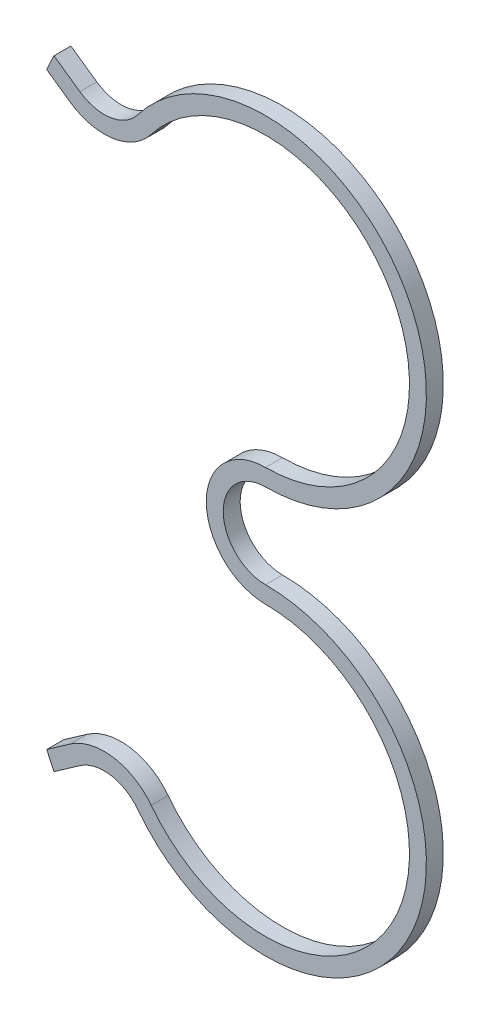
ISO-10303-21;
HEADER;
FILE_DESCRIPTION(('STEP AP214'),'2;1');
FILE_NAME('part.step','',(''),(''),'','','');
FILE_SCHEMA(('AUTOMOTIVE_DESIGN { 1 0 10303 214 1 1 1 1 }'));
ENDSEC;
DATA;
#1=APPLICATION_CONTEXT('core data for automotive mechanical design processes');
#2=APPLICATION_PROTOCOL_DEFINITION('international standard','automotive_design',2000,#1);
#3=PRODUCT_CONTEXT('',#1,'mechanical');
#4=PRODUCT('Part','Part','',(#3));
#5=PRODUCT_RELATED_PRODUCT_CATEGORY('part','',(#4));
#6=PRODUCT_DEFINITION_FORMATION('','',#4);
#7=PRODUCT_DEFINITION_CONTEXT('part definition',#1,'design');
#8=PRODUCT_DEFINITION('design','',#6,#7);
#9=PRODUCT_DEFINITION_SHAPE('','',#8);
#10=(LENGTH_UNIT() NAMED_UNIT(*) SI_UNIT(.MILLI.,.METRE.));
#11=(NAMED_UNIT(*) PLANE_ANGLE_UNIT() SI_UNIT($,.RADIAN.));
#12=(NAMED_UNIT(*) SI_UNIT($,.STERADIAN.) SOLID_ANGLE_UNIT());
#13=UNCERTAINTY_MEASURE_WITH_UNIT(LENGTH_MEASURE(1.E-05),#10,'distance_accuracy_value','');
#14=(GEOMETRIC_REPRESENTATION_CONTEXT(3) GLOBAL_UNCERTAINTY_ASSIGNED_CONTEXT((#13)) GLOBAL_UNIT_ASSIGNED_CONTEXT((#10,
#11,#12)) REPRESENTATION_CONTEXT('',''));
#15=CARTESIAN_POINT('',(0.,0.,0.));
#16=DIRECTION('',(0.,0.,1.));
#17=DIRECTION('',(1.,0.,0.));
#18=AXIS2_PLACEMENT_3D('',#15,#16,#17);
#19=CARTESIAN_POINT('',(0.,12.,1.));
#20=DIRECTION('',(0.,0.,-1.));
#21=DIRECTION('',(-1.,0.,0.));
#22=AXIS2_PLACEMENT_3D('',#19,#20,#21);
#23=CYLINDRICAL_SURFACE('',#22,14.);
#24=DIRECTION('',(0.,0.,-1.));
#25=VECTOR('',#24,1.);
#26=CARTESIAN_POINT('',(-12.4976565513617,18.3094041496965,1.));
#27=LINE('',#26,#25);
#28=CARTESIAN_POINT('',(-12.4976565513617,18.3094041496965,0.));
#29=VERTEX_POINT('',#28);
#30=CARTESIAN_POINT('',(-12.4976565513617,18.3094041496965,1.));
#31=VERTEX_POINT('',#30);
#32=EDGE_CURVE('E153',#29,#31,#27,.F.);
#33=ORIENTED_EDGE('',*,*,#32,.F.);
#34=CARTESIAN_POINT('',(0.,12.,0.));
#35=DIRECTION('',(0.,0.,1.));
#36=DIRECTION('',(1.,0.,0.));
#37=AXIS2_PLACEMENT_3D('',#34,#35,#36);
#38=CIRCLE('',#37,14.);
#39=CARTESIAN_POINT('',(-12.9224650406686,17.3860836674432,0.));
#40=VERTEX_POINT('',#39);
#41=EDGE_CURVE('E150',#29,#40,#38,.T.);
#42=ORIENTED_EDGE('',*,*,#41,.T.);
#43=DIRECTION('',(0.,0.,-1.));
#44=VECTOR('',#43,1.);
#45=CARTESIAN_POINT('',(-12.9224650406686,17.3860836674432,1.));
#46=LINE('',#45,#44);
#47=CARTESIAN_POINT('',(-12.9224650406686,17.3860836674432,1.));
#48=VERTEX_POINT('',#47);
#49=EDGE_CURVE('E47',#48,#40,#46,.T.);
#50=ORIENTED_EDGE('',*,*,#49,.F.);
#51=CARTESIAN_POINT('',(0.,12.,1.));
#52=DIRECTION('',(0.,0.,1.));
#53=DIRECTION('',(1.,0.,0.));
#54=AXIS2_PLACEMENT_3D('',#51,#52,#53);
#55=CIRCLE('',#54,14.);
#56=EDGE_CURVE('E103',#31,#48,#55,.T.);
#57=ORIENTED_EDGE('',*,*,#56,.F.);
#58=EDGE_LOOP('',(#33,#42,#50,#57));
#59=FACE_BOUND('',#58,.T.);
#60=ADVANCED_FACE('F40',(#59),#23,.T.);
#61=CARTESIAN_POINT('',(0.,-12.,1.));
#62=DIRECTION('',(0.,0.,-1.));
#63=DIRECTION('',(-1.,0.,0.));
#64=AXIS2_PLACEMENT_3D('',#61,#62,#63);
#65=CYLINDRICAL_SURFACE('',#64,14.);
#66=DIRECTION('',(0.,0.,-1.));
#67=VECTOR('',#66,1.);
#68=CARTESIAN_POINT('',(-12.4976565513617,-18.3094041496964,1.));
#69=LINE('',#68,#67);
#70=CARTESIAN_POINT('',(-12.4976565513617,-18.3094041496964,1.));
#71=VERTEX_POINT('',#70);
#72=CARTESIAN_POINT('',(-12.4976565513617,-18.3094041496964,0.));
#73=VERTEX_POINT('',#72);
#74=EDGE_CURVE('E53',#71,#73,#69,.T.);
#75=ORIENTED_EDGE('',*,*,#74,.F.);
#76=CARTESIAN_POINT('',(0.,-12.,1.));
#77=DIRECTION('',(0.,0.,1.));
#78=DIRECTION('',(1.,0.,0.));
#79=AXIS2_PLACEMENT_3D('',#76,#77,#78);
#80=CIRCLE('',#79,14.);
#81=CARTESIAN_POINT('',(-12.9224650406686,-17.3860836674432,1.));
#82=VERTEX_POINT('',#81);
#83=EDGE_CURVE('E144',#82,#71,#80,.T.);
#84=ORIENTED_EDGE('',*,*,#83,.F.);
#85=DIRECTION('',(0.,0.,-1.));
#86=VECTOR('',#85,1.);
#87=CARTESIAN_POINT('',(-12.9224650406686,-17.3860836674432,1.));
#88=LINE('',#87,#86);
#89=CARTESIAN_POINT('',(-12.9224650406686,-17.3860836674432,0.));
#90=VERTEX_POINT('',#89);
#91=EDGE_CURVE('E149',#82,#90,#88,.T.);
#92=ORIENTED_EDGE('',*,*,#91,.T.);
#93=CARTESIAN_POINT('',(0.,-12.,0.));
#94=DIRECTION('',(0.,0.,1.));
#95=DIRECTION('',(1.,0.,0.));
#96=AXIS2_PLACEMENT_3D('',#93,#94,#95);
#97=CIRCLE('',#96,14.);
#98=EDGE_CURVE('E165',#90,#73,#97,.T.);
#99=ORIENTED_EDGE('',*,*,#98,.T.);
#100=EDGE_LOOP('',(#75,#84,#92,#99));
#101=FACE_BOUND('',#100,.T.);
#102=ADVANCED_FACE('F332',(#101),#65,.T.);
#103=CARTESIAN_POINT('',(0.,12.,1.));
#104=DIRECTION('',(0.,0.,1.));
#105=DIRECTION('',(1.,0.,0.));
#106=AXIS2_PLACEMENT_3D('',#103,#104,#105);
#107=PLANE('',#106);
#108=CARTESIAN_POINT('',(-9.53449977279251,19.2865159083488,1.));
#109=DIRECTION('',(0.,0.,-1.));
#110=DIRECTION('',(1.,0.,0.));
#111=AXIS2_PLACEMENT_3D('',#108,#109,#110);
#112=CIRCLE('',#111,2.5);
#113=CARTESIAN_POINT('',(-7.54814565346074,17.7684917607761,1.));
#114=VERTEX_POINT('',#113);
#115=CARTESIAN_POINT('',(-10.9684408636701,17.2386357976263,1.));
#116=VERTEX_POINT('',#115);
#117=EDGE_CURVE('E236',#114,#116,#112,.T.);
#118=ORIENTED_EDGE('',*,*,#117,.T.);
#119=DIRECTION('',(-0.819152044288993,0.573576436351044,0.));
#120=VECTOR('',#119,1.);
#121=CARTESIAN_POINT('',(-12.3488886043175,18.2052357117322,1.));
#122=LINE('',#121,#120);
#123=EDGE_CURVE('E233',#116,#31,#122,.T.);
#124=ORIENTED_EDGE('',*,*,#123,.T.);
#125=ORIENTED_EDGE('',*,*,#56,.T.);
#126=DIRECTION('',(0.819152044288992,-0.573576436351046,0.));
#127=VECTOR('',#126,1.);
#128=CARTESIAN_POINT('',(-12.9224650406686,17.3860836674432,1.));
#129=LINE('',#128,#127);
#130=CARTESIAN_POINT('',(-11.5420173000212,16.4194837533373,1.));
#131=VERTEX_POINT('',#130);
#132=EDGE_CURVE('E185',#48,#131,#129,.T.);
#133=ORIENTED_EDGE('',*,*,#132,.T.);
#134=CARTESIAN_POINT('',(-9.53449977279251,19.2865159083488,1.));
#135=DIRECTION('',(0.,0.,1.));
#136=DIRECTION('',(1.,0.,0.));
#137=AXIS2_PLACEMENT_3D('',#134,#135,#136);
#138=CIRCLE('',#137,3.5);
#139=CARTESIAN_POINT('',(-6.75360400572803,17.161282101747,1.));
#140=VERTEX_POINT('',#139);
#141=EDGE_CURVE('E206',#131,#140,#138,.T.);
#142=ORIENTED_EDGE('',*,*,#141,.T.);
#143=CARTESIAN_POINT('',(0.,12.,1.));
#144=DIRECTION('',(0.,0.,-1.));
#145=DIRECTION('',(1.,0.,0.));
#146=AXIS2_PLACEMENT_3D('',#143,#144,#145);
#147=CIRCLE('',#146,8.5);
#148=CARTESIAN_POINT('',(0.,3.5,1.));
#149=VERTEX_POINT('',#148);
#150=EDGE_CURVE('E205',#140,#149,#147,.T.);
#151=ORIENTED_EDGE('',*,*,#150,.T.);
#152=CARTESIAN_POINT('',(0.,0.,1.));
#153=DIRECTION('',(0.,0.,1.));
#154=DIRECTION('',(1.,0.,0.));
#155=AXIS2_PLACEMENT_3D('',#152,#153,#154);
#156=CIRCLE('',#155,3.5);
#157=CARTESIAN_POINT('',(0.,-3.5,1.));
#158=VERTEX_POINT('',#157);
#159=EDGE_CURVE('E127',#149,#158,#156,.T.);
#160=ORIENTED_EDGE('',*,*,#159,.T.);
#161=CARTESIAN_POINT('',(0.,-12.,1.));
#162=DIRECTION('',(0.,0.,-1.));
#163=DIRECTION('',(1.,0.,0.));
#164=AXIS2_PLACEMENT_3D('',#161,#162,#163);
#165=CIRCLE('',#164,8.5);
#166=CARTESIAN_POINT('',(-6.75360400572803,-17.161282101747,1.));
#167=VERTEX_POINT('',#166);
#168=EDGE_CURVE('E119',#158,#167,#165,.T.);
#169=ORIENTED_EDGE('',*,*,#168,.T.);
#170=CARTESIAN_POINT('',(-9.53449977279251,-19.2865159083488,1.));
#171=DIRECTION('',(0.,0.,1.));
#172=DIRECTION('',(1.,0.,0.));
#173=AXIS2_PLACEMENT_3D('',#170,#171,#172);
#174=CIRCLE('',#173,3.5);
#175=CARTESIAN_POINT('',(-11.5420173000212,-16.4194837533373,1.));
#176=VERTEX_POINT('',#175);
#177=EDGE_CURVE('E124',#167,#176,#174,.T.);
#178=ORIENTED_EDGE('',*,*,#177,.T.);
#179=DIRECTION('',(-0.819152044288992,-0.573576436351046,0.));
#180=VECTOR('',#179,1.);
#181=CARTESIAN_POINT('',(-11.5420173000212,-16.4194837533373,1.));
#182=LINE('',#181,#180);
#183=EDGE_CURVE('E62',#176,#82,#182,.T.);
#184=ORIENTED_EDGE('',*,*,#183,.T.);
#185=ORIENTED_EDGE('',*,*,#83,.T.);
#186=DIRECTION('',(0.819152044288993,0.573576436351044,0.));
#187=VECTOR('',#186,1.);
#188=CARTESIAN_POINT('',(-10.9684408636701,-17.2386357976263,1.));
#189=LINE('',#188,#187);
#190=CARTESIAN_POINT('',(-10.9684408636701,-17.2386357976263,1.));
#191=VERTEX_POINT('',#190);
#192=EDGE_CURVE('E250',#71,#191,#189,.T.);
#193=ORIENTED_EDGE('',*,*,#192,.T.);
#194=CARTESIAN_POINT('',(-9.53449977279251,-19.2865159083488,1.));
#195=DIRECTION('',(0.,0.,-1.));
#196=DIRECTION('',(1.,0.,0.));
#197=AXIS2_PLACEMENT_3D('',#194,#195,#196);
#198=CIRCLE('',#197,2.5);
#199=CARTESIAN_POINT('',(-7.54814565346074,-17.7684917607761,1.));
#200=VERTEX_POINT('',#199);
#201=EDGE_CURVE('E247',#191,#200,#198,.T.);
#202=ORIENTED_EDGE('',*,*,#201,.T.);
#203=CARTESIAN_POINT('',(0.,-12.,1.));
#204=DIRECTION('',(0.,0.,1.));
#205=DIRECTION('',(1.,0.,0.));
#206=AXIS2_PLACEMENT_3D('',#203,#204,#205);
#207=CIRCLE('',#206,9.5);
#208=CARTESIAN_POINT('',(0.,-2.5,1.));
#209=VERTEX_POINT('',#208);
#210=EDGE_CURVE('E244',#200,#209,#207,.T.);
#211=ORIENTED_EDGE('',*,*,#210,.T.);
#212=CARTESIAN_POINT('',(0.,0.,1.));
#213=DIRECTION('',(0.,0.,-1.));
#214=DIRECTION('',(1.,0.,0.));
#215=AXIS2_PLACEMENT_3D('',#212,#213,#214);
#216=CIRCLE('',#215,2.5);
#217=CARTESIAN_POINT('',(0.,2.5,1.));
#218=VERTEX_POINT('',#217);
#219=EDGE_CURVE('E241',#209,#218,#216,.T.);
#220=ORIENTED_EDGE('',*,*,#219,.T.);
#221=CARTESIAN_POINT('',(0.,12.,1.));
#222=DIRECTION('',(0.,0.,1.));
#223=DIRECTION('',(1.,0.,0.));
#224=AXIS2_PLACEMENT_3D('',#221,#222,#223);
#225=CIRCLE('',#224,9.5);
#226=EDGE_CURVE('E238',#218,#114,#225,.T.);
#227=ORIENTED_EDGE('',*,*,#226,.T.);
#228=EDGE_LOOP('',(#118,#124,#125,#133,#142,#151,#160,#169,#178,#184,#185,#193,#202,#211,#220,#227));
#229=FACE_BOUND('',#228,.T.);
#230=ADVANCED_FACE('F122',(#229),#107,.T.);
#231=CARTESIAN_POINT('',(0.,12.,0.));
#232=DIRECTION('',(0.,0.,1.));
#233=DIRECTION('',(1.,0.,0.));
#234=AXIS2_PLACEMENT_3D('',#231,#232,#233);
#235=PLANE('',#234);
#236=DIRECTION('',(-0.819152044288991,0.573576436351047,0.));
#237=VECTOR('',#236,1.);
#238=CARTESIAN_POINT('',(-12.3488886043175,18.2052357117322,0.));
#239=LINE('',#238,#237);
#240=CARTESIAN_POINT('',(-10.9684408636701,17.2386357976263,0.));
#241=VERTEX_POINT('',#240);
#242=EDGE_CURVE('E219',#241,#29,#239,.T.);
#243=ORIENTED_EDGE('',*,*,#242,.F.);
#244=CARTESIAN_POINT('',(-9.53449977279251,19.2865159083488,0.));
#245=DIRECTION('',(0.,0.,-1.));
#246=DIRECTION('',(1.,0.,0.));
#247=AXIS2_PLACEMENT_3D('',#244,#245,#246);
#248=CIRCLE('',#247,2.5);
#249=CARTESIAN_POINT('',(-7.54814565346074,17.7684917607761,0.));
#250=VERTEX_POINT('',#249);
#251=EDGE_CURVE('E255',#250,#241,#248,.T.);
#252=ORIENTED_EDGE('',*,*,#251,.F.);
#253=CARTESIAN_POINT('',(0.,12.,0.));
#254=DIRECTION('',(0.,0.,1.));
#255=DIRECTION('',(1.,0.,0.));
#256=AXIS2_PLACEMENT_3D('',#253,#254,#255);
#257=CIRCLE('',#256,9.5);
#258=CARTESIAN_POINT('',(0.,2.5,0.));
#259=VERTEX_POINT('',#258);
#260=EDGE_CURVE('E258',#259,#250,#257,.T.);
#261=ORIENTED_EDGE('',*,*,#260,.F.);
#262=CARTESIAN_POINT('',(0.,0.,0.));
#263=DIRECTION('',(0.,0.,-1.));
#264=DIRECTION('',(1.,0.,0.));
#265=AXIS2_PLACEMENT_3D('',#262,#263,#264);
#266=CIRCLE('',#265,2.5);
#267=CARTESIAN_POINT('',(0.,-2.5,0.));
#268=VERTEX_POINT('',#267);
#269=EDGE_CURVE('E261',#268,#259,#266,.T.);
#270=ORIENTED_EDGE('',*,*,#269,.F.);
#271=CARTESIAN_POINT('',(0.,-12.,0.));
#272=DIRECTION('',(0.,0.,1.));
#273=DIRECTION('',(1.,0.,0.));
#274=AXIS2_PLACEMENT_3D('',#271,#272,#273);
#275=CIRCLE('',#274,9.5);
#276=CARTESIAN_POINT('',(-7.54814565346074,-17.7684917607761,0.));
#277=VERTEX_POINT('',#276);
#278=EDGE_CURVE('E264',#277,#268,#275,.T.);
#279=ORIENTED_EDGE('',*,*,#278,.F.);
#280=CARTESIAN_POINT('',(-9.53449977279251,-19.2865159083488,0.));
#281=DIRECTION('',(0.,0.,-1.));
#282=DIRECTION('',(1.,0.,0.));
#283=AXIS2_PLACEMENT_3D('',#280,#281,#282);
#284=CIRCLE('',#283,2.5);
#285=CARTESIAN_POINT('',(-10.9684408636701,-17.2386357976263,0.));
#286=VERTEX_POINT('',#285);
#287=EDGE_CURVE('E235',#286,#277,#284,.T.);
#288=ORIENTED_EDGE('',*,*,#287,.F.);
#289=DIRECTION('',(0.819152044288993,0.573576436351044,0.));
#290=VECTOR('',#289,1.);
#291=CARTESIAN_POINT('',(10.1291585767288,-2.46593763133009,0.));
#292=LINE('',#291,#290);
#293=EDGE_CURVE('E12',#73,#286,#292,.T.);
#294=ORIENTED_EDGE('',*,*,#293,.F.);
#295=ORIENTED_EDGE('',*,*,#98,.F.);
#296=DIRECTION('',(-0.819152044288992,-0.573576436351046,0.));
#297=VECTOR('',#296,1.);
#298=CARTESIAN_POINT('',(-11.5420173000212,-16.4194837533373,0.));
#299=LINE('',#298,#297);
#300=CARTESIAN_POINT('',(-11.5420173000212,-16.4194837533373,0.));
#301=VERTEX_POINT('',#300);
#302=EDGE_CURVE('E95',#301,#90,#299,.T.);
#303=ORIENTED_EDGE('',*,*,#302,.F.);
#304=CARTESIAN_POINT('',(-9.53449977279251,-19.2865159083488,0.));
#305=DIRECTION('',(0.,0.,1.));
#306=DIRECTION('',(1.,0.,0.));
#307=AXIS2_PLACEMENT_3D('',#304,#305,#306);
#308=CIRCLE('',#307,3.5);
#309=CARTESIAN_POINT('',(-6.75360400572803,-17.161282101747,0.));
#310=VERTEX_POINT('',#309);
#311=EDGE_CURVE('E162',#310,#301,#308,.T.);
#312=ORIENTED_EDGE('',*,*,#311,.F.);
#313=CARTESIAN_POINT('',(0.,-12.,0.));
#314=DIRECTION('',(0.,0.,-1.));
#315=DIRECTION('',(1.,0.,0.));
#316=AXIS2_PLACEMENT_3D('',#313,#314,#315);
#317=CIRCLE('',#316,8.5);
#318=CARTESIAN_POINT('',(0.,-3.5,0.));
#319=VERTEX_POINT('',#318);
#320=EDGE_CURVE('E136',#319,#310,#317,.T.);
#321=ORIENTED_EDGE('',*,*,#320,.F.);
#322=CARTESIAN_POINT('',(0.,0.,0.));
#323=DIRECTION('',(0.,0.,1.));
#324=DIRECTION('',(1.,0.,0.));
#325=AXIS2_PLACEMENT_3D('',#322,#323,#324);
#326=CIRCLE('',#325,3.5);
#327=CARTESIAN_POINT('',(0.,3.5,0.));
#328=VERTEX_POINT('',#327);
#329=EDGE_CURVE('E159',#328,#319,#326,.T.);
#330=ORIENTED_EDGE('',*,*,#329,.F.);
#331=CARTESIAN_POINT('',(0.,12.,0.));
#332=DIRECTION('',(0.,0.,-1.));
#333=DIRECTION('',(1.,0.,0.));
#334=AXIS2_PLACEMENT_3D('',#331,#332,#333);
#335=CIRCLE('',#334,8.5);
#336=CARTESIAN_POINT('',(-6.75360400572803,17.161282101747,0.));
#337=VERTEX_POINT('',#336);
#338=EDGE_CURVE('E157',#337,#328,#335,.T.);
#339=ORIENTED_EDGE('',*,*,#338,.F.);
#340=CARTESIAN_POINT('',(-9.53449977279251,19.2865159083488,0.));
#341=DIRECTION('',(0.,0.,1.));
#342=DIRECTION('',(1.,0.,0.));
#343=AXIS2_PLACEMENT_3D('',#340,#341,#342);
#344=CIRCLE('',#343,3.5);
#345=CARTESIAN_POINT('',(-11.5420173000212,16.4194837533373,0.));
#346=VERTEX_POINT('',#345);
#347=EDGE_CURVE('E155',#346,#337,#344,.T.);
#348=ORIENTED_EDGE('',*,*,#347,.F.);
#349=DIRECTION('',(0.819152044288992,-0.573576436351046,0.));
#350=VECTOR('',#349,1.);
#351=CARTESIAN_POINT('',(-12.9224650406686,17.3860836674432,0.));
#352=LINE('',#351,#350);
#353=EDGE_CURVE('E152',#40,#346,#352,.T.);
#354=ORIENTED_EDGE('',*,*,#353,.F.);
#355=ORIENTED_EDGE('',*,*,#41,.F.);
#356=EDGE_LOOP('',(#243,#252,#261,#270,#279,#288,#294,#295,#303,#312,#321,#330,#339,#348,#354,#355));
#357=FACE_BOUND('',#356,.T.);
#358=ADVANCED_FACE('F194',(#357),#235,.F.);
#359=CARTESIAN_POINT('',(-12.9224650406686,17.3860836674432,1.));
#360=DIRECTION('',(0.573576436351046,0.819152044288992,0.));
#361=DIRECTION('',(-0.819152044288992,0.573576436351046,0.));
#362=AXIS2_PLACEMENT_3D('',#359,#360,#361);
#363=PLANE('',#362);
#364=ORIENTED_EDGE('',*,*,#353,.T.);
#365=DIRECTION('',(0.,0.,-1.));
#366=VECTOR('',#365,1.);
#367=CARTESIAN_POINT('',(-11.5420173000212,16.4194837533373,1.));
#368=LINE('',#367,#366);
#369=EDGE_CURVE('E177',#131,#346,#368,.T.);
#370=ORIENTED_EDGE('',*,*,#369,.F.);
#371=ORIENTED_EDGE('',*,*,#132,.F.);
#372=ORIENTED_EDGE('',*,*,#49,.T.);
#373=EDGE_LOOP('',(#364,#370,#371,#372));
#374=FACE_BOUND('',#373,.T.);
#375=ADVANCED_FACE('F182',(#374),#363,.F.);
#376=CARTESIAN_POINT('',(-9.53449977279251,19.2865159083488,1.));
#377=DIRECTION('',(0.,0.,-1.));
#378=DIRECTION('',(-1.,0.,0.));
#379=AXIS2_PLACEMENT_3D('',#376,#377,#378);
#380=CYLINDRICAL_SURFACE('',#379,3.5);
#381=ORIENTED_EDGE('',*,*,#347,.T.);
#382=DIRECTION('',(0.,0.,-1.));
#383=VECTOR('',#382,1.);
#384=CARTESIAN_POINT('',(-6.75360400572803,17.161282101747,1.));
#385=LINE('',#384,#383);
#386=EDGE_CURVE('E174',#140,#337,#385,.T.);
#387=ORIENTED_EDGE('',*,*,#386,.F.);
#388=ORIENTED_EDGE('',*,*,#141,.F.);
#389=ORIENTED_EDGE('',*,*,#369,.T.);
#390=EDGE_LOOP('',(#381,#387,#388,#389));
#391=FACE_BOUND('',#390,.T.);
#392=ADVANCED_FACE('F199',(#391),#380,.T.);
#393=CARTESIAN_POINT('',(0.,12.,1.));
#394=DIRECTION('',(0.,0.,-1.));
#395=DIRECTION('',(-1.,0.,0.));
#396=AXIS2_PLACEMENT_3D('',#393,#394,#395);
#397=CYLINDRICAL_SURFACE('',#396,8.5);
#398=ORIENTED_EDGE('',*,*,#338,.T.);
#399=DIRECTION('',(0.,0.,-1.));
#400=VECTOR('',#399,1.);
#401=CARTESIAN_POINT('',(0.,3.5,1.));
#402=LINE('',#401,#400);
#403=EDGE_CURVE('E171',#149,#328,#402,.T.);
#404=ORIENTED_EDGE('',*,*,#403,.F.);
#405=ORIENTED_EDGE('',*,*,#150,.F.);
#406=ORIENTED_EDGE('',*,*,#386,.T.);
#407=EDGE_LOOP('',(#398,#404,#405,#406));
#408=FACE_BOUND('',#407,.T.);
#409=ADVANCED_FACE('F203',(#408),#397,.F.);
#410=CARTESIAN_POINT('',(0.,0.,1.));
#411=DIRECTION('',(0.,0.,-1.));
#412=DIRECTION('',(-1.,0.,0.));
#413=AXIS2_PLACEMENT_3D('',#410,#411,#412);
#414=CYLINDRICAL_SURFACE('',#413,3.5);
#415=ORIENTED_EDGE('',*,*,#329,.T.);
#416=DIRECTION('',(0.,0.,-1.));
#417=VECTOR('',#416,1.);
#418=CARTESIAN_POINT('',(0.,-3.5,1.));
#419=LINE('',#418,#417);
#420=EDGE_CURVE('E139',#158,#319,#419,.T.);
#421=ORIENTED_EDGE('',*,*,#420,.F.);
#422=ORIENTED_EDGE('',*,*,#159,.F.);
#423=ORIENTED_EDGE('',*,*,#403,.T.);
#424=EDGE_LOOP('',(#415,#421,#422,#423));
#425=FACE_BOUND('',#424,.T.);
#426=ADVANCED_FACE('F351',(#425),#414,.T.);
#427=CARTESIAN_POINT('',(0.,-12.,1.));
#428=DIRECTION('',(0.,0.,-1.));
#429=DIRECTION('',(-1.,0.,0.));
#430=AXIS2_PLACEMENT_3D('',#427,#428,#429);
#431=CYLINDRICAL_SURFACE('',#430,8.5);
#432=ORIENTED_EDGE('',*,*,#320,.T.);
#433=DIRECTION('',(0.,0.,-1.));
#434=VECTOR('',#433,1.);
#435=CARTESIAN_POINT('',(-6.75360400572803,-17.161282101747,1.));
#436=LINE('',#435,#434);
#437=EDGE_CURVE('E133',#167,#310,#436,.T.);
#438=ORIENTED_EDGE('',*,*,#437,.F.);
#439=ORIENTED_EDGE('',*,*,#168,.F.);
#440=ORIENTED_EDGE('',*,*,#420,.T.);
#441=EDGE_LOOP('',(#432,#438,#439,#440));
#442=FACE_BOUND('',#441,.T.);
#443=ADVANCED_FACE('F134',(#442),#431,.F.);
#444=CARTESIAN_POINT('',(-9.53449977279251,-19.2865159083488,1.));
#445=DIRECTION('',(0.,0.,-1.));
#446=DIRECTION('',(-1.,0.,0.));
#447=AXIS2_PLACEMENT_3D('',#444,#445,#446);
#448=CYLINDRICAL_SURFACE('',#447,3.5);
#449=ORIENTED_EDGE('',*,*,#311,.T.);
#450=DIRECTION('',(0.,0.,-1.));
#451=VECTOR('',#450,1.);
#452=CARTESIAN_POINT('',(-11.5420173000212,-16.4194837533373,1.));
#453=LINE('',#452,#451);
#454=EDGE_CURVE('E140',#176,#301,#453,.T.);
#455=ORIENTED_EDGE('',*,*,#454,.F.);
#456=ORIENTED_EDGE('',*,*,#177,.F.);
#457=ORIENTED_EDGE('',*,*,#437,.T.);
#458=EDGE_LOOP('',(#449,#455,#456,#457));
#459=FACE_BOUND('',#458,.T.);
#460=ADVANCED_FACE('F142',(#459),#448,.T.);
#461=CARTESIAN_POINT('',(-11.5420173000212,-16.4194837533373,1.));
#462=DIRECTION('',(0.573576436351046,-0.819152044288992,0.));
#463=DIRECTION('',(0.819152044288992,0.573576436351046,0.));
#464=AXIS2_PLACEMENT_3D('',#461,#462,#463);
#465=PLANE('',#464);
#466=ORIENTED_EDGE('',*,*,#302,.T.);
#467=ORIENTED_EDGE('',*,*,#91,.F.);
#468=ORIENTED_EDGE('',*,*,#183,.F.);
#469=ORIENTED_EDGE('',*,*,#454,.T.);
#470=EDGE_LOOP('',(#466,#467,#468,#469));
#471=FACE_BOUND('',#470,.T.);
#472=ADVANCED_FACE('F344',(#471),#465,.F.);
#473=CARTESIAN_POINT('',(-12.3488886043175,18.2052357117322,0.));
#474=DIRECTION('',(0.573576436351044,0.819152044288993,0.));
#475=DIRECTION('',(-0.819152044288993,0.573576436351044,0.));
#476=AXIS2_PLACEMENT_3D('',#473,#474,#475);
#477=PLANE('',#476);
#478=ORIENTED_EDGE('',*,*,#32,.T.);
#479=ORIENTED_EDGE('',*,*,#123,.F.);
#480=DIRECTION('',(0.,0.,1.));
#481=VECTOR('',#480,1.);
#482=CARTESIAN_POINT('',(-10.9684408636701,17.2386357976263,0.));
#483=LINE('',#482,#481);
#484=EDGE_CURVE('E214',#241,#116,#483,.T.);
#485=ORIENTED_EDGE('',*,*,#484,.F.);
#486=ORIENTED_EDGE('',*,*,#242,.T.);
#487=EDGE_LOOP('',(#478,#479,#485,#486));
#488=FACE_BOUND('',#487,.T.);
#489=ADVANCED_FACE('F314',(#488),#477,.T.);
#490=CARTESIAN_POINT('',(-10.9684408636701,-17.2386357976263,0.));
#491=DIRECTION('',(0.573576436351044,-0.819152044288993,0.));
#492=DIRECTION('',(0.819152044288993,0.573576436351044,0.));
#493=AXIS2_PLACEMENT_3D('',#490,#491,#492);
#494=PLANE('',#493);
#495=ORIENTED_EDGE('',*,*,#74,.T.);
#496=ORIENTED_EDGE('',*,*,#293,.T.);
#497=DIRECTION('',(0.,0.,1.));
#498=VECTOR('',#497,1.);
#499=CARTESIAN_POINT('',(-10.9684408636701,-17.2386357976263,0.));
#500=LINE('',#499,#498);
#501=EDGE_CURVE('E215',#286,#191,#500,.T.);
#502=ORIENTED_EDGE('',*,*,#501,.T.);
#503=ORIENTED_EDGE('',*,*,#192,.F.);
#504=EDGE_LOOP('',(#495,#496,#502,#503));
#505=FACE_BOUND('',#504,.T.);
#506=ADVANCED_FACE('F425',(#505),#494,.T.);
#507=CARTESIAN_POINT('',(-9.53449977279251,19.2865159083488,0.));
#508=DIRECTION('',(0.,0.,1.));
#509=DIRECTION('',(1.,0.,0.));
#510=AXIS2_PLACEMENT_3D('',#507,#508,#509);
#511=CYLINDRICAL_SURFACE('',#510,2.5);
#512=ORIENTED_EDGE('',*,*,#117,.F.);
#513=DIRECTION('',(0.,0.,1.));
#514=VECTOR('',#513,1.);
#515=CARTESIAN_POINT('',(-7.54814565346074,17.7684917607761,0.));
#516=LINE('',#515,#514);
#517=EDGE_CURVE('E228',#250,#114,#516,.T.);
#518=ORIENTED_EDGE('',*,*,#517,.F.);
#519=ORIENTED_EDGE('',*,*,#251,.T.);
#520=ORIENTED_EDGE('',*,*,#484,.T.);
#521=EDGE_LOOP('',(#512,#518,#519,#520));
#522=FACE_BOUND('',#521,.T.);
#523=ADVANCED_FACE('F318',(#522),#511,.F.);
#524=CARTESIAN_POINT('',(0.,12.,0.));
#525=DIRECTION('',(0.,0.,1.));
#526=DIRECTION('',(1.,0.,0.));
#527=AXIS2_PLACEMENT_3D('',#524,#525,#526);
#528=CYLINDRICAL_SURFACE('',#527,9.5);
#529=ORIENTED_EDGE('',*,*,#226,.F.);
#530=DIRECTION('',(0.,0.,1.));
#531=VECTOR('',#530,1.);
#532=CARTESIAN_POINT('',(0.,2.5,0.));
#533=LINE('',#532,#531);
#534=EDGE_CURVE('E225',#259,#218,#533,.T.);
#535=ORIENTED_EDGE('',*,*,#534,.F.);
#536=ORIENTED_EDGE('',*,*,#260,.T.);
#537=ORIENTED_EDGE('',*,*,#517,.T.);
#538=EDGE_LOOP('',(#529,#535,#536,#537));
#539=FACE_BOUND('',#538,.T.);
#540=ADVANCED_FACE('F321',(#539),#528,.T.);
#541=CARTESIAN_POINT('',(0.,0.,0.));
#542=DIRECTION('',(0.,0.,1.));
#543=DIRECTION('',(1.,0.,0.));
#544=AXIS2_PLACEMENT_3D('',#541,#542,#543);
#545=CYLINDRICAL_SURFACE('',#544,2.5);
#546=ORIENTED_EDGE('',*,*,#219,.F.);
#547=DIRECTION('',(0.,0.,1.));
#548=VECTOR('',#547,1.);
#549=CARTESIAN_POINT('',(0.,-2.5,0.));
#550=LINE('',#549,#548);
#551=EDGE_CURVE('E222',#268,#209,#550,.T.);
#552=ORIENTED_EDGE('',*,*,#551,.F.);
#553=ORIENTED_EDGE('',*,*,#269,.T.);
#554=ORIENTED_EDGE('',*,*,#534,.T.);
#555=EDGE_LOOP('',(#546,#552,#553,#554));
#556=FACE_BOUND('',#555,.T.);
#557=ADVANCED_FACE('F322',(#556),#545,.F.);
#558=CARTESIAN_POINT('',(0.,-12.,0.));
#559=DIRECTION('',(0.,0.,1.));
#560=DIRECTION('',(1.,0.,0.));
#561=AXIS2_PLACEMENT_3D('',#558,#559,#560);
#562=CYLINDRICAL_SURFACE('',#561,9.5);
#563=ORIENTED_EDGE('',*,*,#210,.F.);
#564=DIRECTION('',(0.,0.,1.));
#565=VECTOR('',#564,1.);
#566=CARTESIAN_POINT('',(-7.54814565346074,-17.7684917607761,0.));
#567=LINE('',#566,#565);
#568=EDGE_CURVE('E218',#277,#200,#567,.T.);
#569=ORIENTED_EDGE('',*,*,#568,.F.);
#570=ORIENTED_EDGE('',*,*,#278,.T.);
#571=ORIENTED_EDGE('',*,*,#551,.T.);
#572=EDGE_LOOP('',(#563,#569,#570,#571));
#573=FACE_BOUND('',#572,.T.);
#574=ADVANCED_FACE('F284',(#573),#562,.T.);
#575=CARTESIAN_POINT('',(-9.53449977279251,-19.2865159083488,0.));
#576=DIRECTION('',(0.,0.,1.));
#577=DIRECTION('',(1.,0.,0.));
#578=AXIS2_PLACEMENT_3D('',#575,#576,#577);
#579=CYLINDRICAL_SURFACE('',#578,2.5);
#580=ORIENTED_EDGE('',*,*,#201,.F.);
#581=ORIENTED_EDGE('',*,*,#501,.F.);
#582=ORIENTED_EDGE('',*,*,#287,.T.);
#583=ORIENTED_EDGE('',*,*,#568,.T.);
#584=EDGE_LOOP('',(#580,#581,#582,#583));
#585=FACE_BOUND('',#584,.T.);
#586=ADVANCED_FACE('F274',(#585),#579,.F.);
#587=CLOSED_SHELL('',(#60,#102,#230,#358,#375,#392,#409,#426,#443,#460,#472,#489,#506,#523,#540,
#557,#574,#586));
#588=MANIFOLD_SOLID_BREP('B2',#587);
#589=ADVANCED_BREP_SHAPE_REPRESENTATION('',(#18,#588),#14);
#590=SHAPE_DEFINITION_REPRESENTATION(#9,#589);
ENDSEC;
END-ISO-10303-21;
